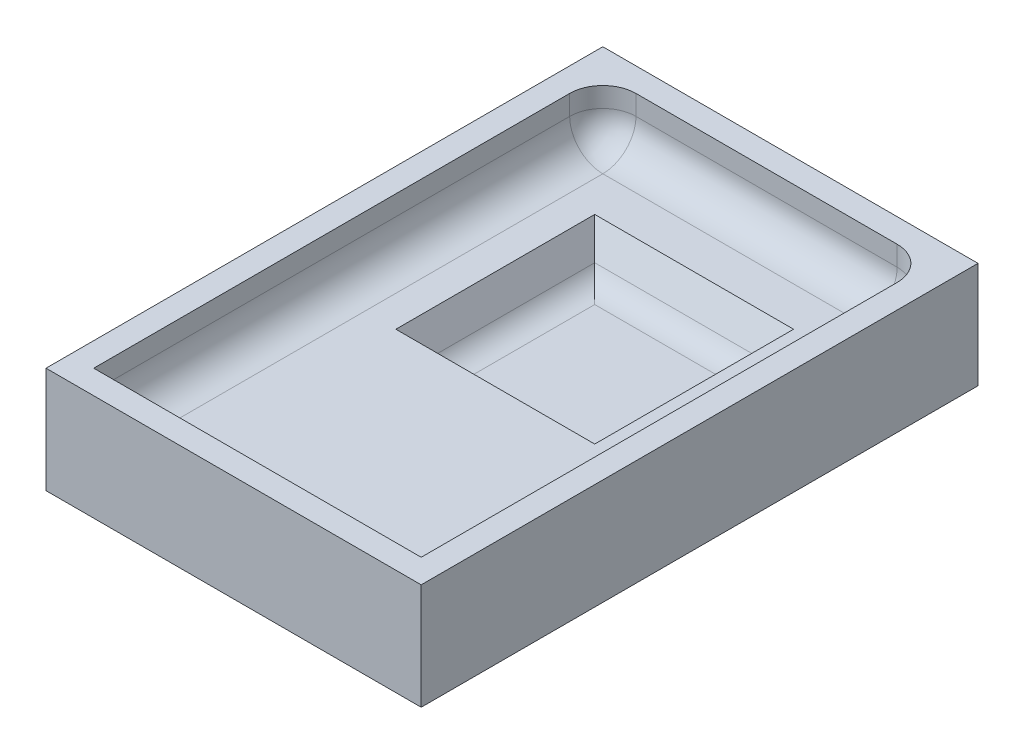
ISO-10303-21;
HEADER;
FILE_DESCRIPTION(('STEP AP214'),'2;1');
FILE_NAME('part.step','',(''),(''),'','','');
FILE_SCHEMA(('AUTOMOTIVE_DESIGN { 1 0 10303 214 1 1 1 1 }'));
ENDSEC;
DATA;
#1=APPLICATION_CONTEXT('core data for automotive mechanical design processes');
#2=APPLICATION_PROTOCOL_DEFINITION('international standard','automotive_design',2000,#1);
#3=PRODUCT_CONTEXT('',#1,'mechanical');
#4=PRODUCT('Part','Part','',(#3));
#5=PRODUCT_RELATED_PRODUCT_CATEGORY('part','',(#4));
#6=PRODUCT_DEFINITION_FORMATION('','',#4);
#7=PRODUCT_DEFINITION_CONTEXT('part definition',#1,'design');
#8=PRODUCT_DEFINITION('design','',#6,#7);
#9=PRODUCT_DEFINITION_SHAPE('','',#8);
#10=(LENGTH_UNIT() NAMED_UNIT(*) SI_UNIT(.MILLI.,.METRE.));
#11=(NAMED_UNIT(*) PLANE_ANGLE_UNIT() SI_UNIT($,.RADIAN.));
#12=(NAMED_UNIT(*) SI_UNIT($,.STERADIAN.) SOLID_ANGLE_UNIT());
#13=UNCERTAINTY_MEASURE_WITH_UNIT(LENGTH_MEASURE(1.E-05),#10,'distance_accuracy_value','');
#14=(GEOMETRIC_REPRESENTATION_CONTEXT(3) GLOBAL_UNCERTAINTY_ASSIGNED_CONTEXT((#13)) GLOBAL_UNIT_ASSIGNED_CONTEXT((#10,
#11,#12)) REPRESENTATION_CONTEXT('',''));
#15=CARTESIAN_POINT('',(0.,0.,0.));
#16=DIRECTION('',(0.,0.,1.));
#17=DIRECTION('',(1.,0.,0.));
#18=AXIS2_PLACEMENT_3D('',#15,#16,#17);
#19=CARTESIAN_POINT('',(0.,4.,0.));
#20=DIRECTION('',(0.,-1.,0.));
#21=DIRECTION('',(0.,0.,-1.));
#22=AXIS2_PLACEMENT_3D('',#19,#20,#21);
#23=PLANE('',#22);
#24=DIRECTION('',(1.,0.,0.));
#25=VECTOR('',#24,1.);
#26=CARTESIAN_POINT('',(1.8,4.,-1.8));
#27=LINE('',#26,#25);
#28=CARTESIAN_POINT('',(4.30000000000001,4.,-1.8));
#29=VERTEX_POINT('',#28);
#30=CARTESIAN_POINT('',(24.,4.,-1.8));
#31=VERTEX_POINT('',#30);
#32=EDGE_CURVE('E175',#29,#31,#27,.T.);
#33=ORIENTED_EDGE('',*,*,#32,.T.);
#34=DIRECTION('',(0.,0.,-1.));
#35=VECTOR('',#34,1.);
#36=CARTESIAN_POINT('',(24.,4.,0.));
#37=LINE('',#36,#35);
#38=CARTESIAN_POINT('',(24.,4.,-37.7));
#39=VERTEX_POINT('',#38);
#40=EDGE_CURVE('E324',#31,#39,#37,.T.);
#41=ORIENTED_EDGE('',*,*,#40,.T.);
#42=DIRECTION('',(-1.,0.,0.));
#43=VECTOR('',#42,1.);
#44=CARTESIAN_POINT('',(0.,4.,-37.7));
#45=LINE('',#44,#43);
#46=CARTESIAN_POINT('',(4.30000000000001,4.,-37.7));
#47=VERTEX_POINT('',#46);
#48=EDGE_CURVE('E321',#39,#47,#45,.T.);
#49=ORIENTED_EDGE('',*,*,#48,.T.);
#50=DIRECTION('',(0.,0.,1.));
#51=VECTOR('',#50,1.);
#52=CARTESIAN_POINT('',(4.30000000000001,4.,0.));
#53=LINE('',#52,#51);
#54=EDGE_CURVE('E306',#47,#29,#53,.T.);
#55=ORIENTED_EDGE('',*,*,#54,.T.);
#56=EDGE_LOOP('',(#33,#41,#49,#55));
#57=FACE_BOUND('',#56,.T.);
#58=DIRECTION('',(1.,0.,0.));
#59=VECTOR('',#58,1.);
#60=CARTESIAN_POINT('',(6.65,4.,-19.74));
#61=LINE('',#60,#59);
#62=CARTESIAN_POINT('',(6.65,4.,-19.74));
#63=VERTEX_POINT('',#62);
#64=CARTESIAN_POINT('',(21.65,4.,-19.74));
#65=VERTEX_POINT('',#64);
#66=EDGE_CURVE('E226',#63,#65,#61,.T.);
#67=ORIENTED_EDGE('',*,*,#66,.F.);
#68=DIRECTION('',(0.,0.,1.));
#69=VECTOR('',#68,1.);
#70=CARTESIAN_POINT('',(6.65,4.,-34.74));
#71=LINE('',#70,#69);
#72=CARTESIAN_POINT('',(6.65,4.,-34.74));
#73=VERTEX_POINT('',#72);
#74=EDGE_CURVE('E222',#73,#63,#71,.T.);
#75=ORIENTED_EDGE('',*,*,#74,.F.);
#76=DIRECTION('',(-1.,0.,0.));
#77=VECTOR('',#76,1.);
#78=CARTESIAN_POINT('',(6.65,4.,-34.74));
#79=LINE('',#78,#77);
#80=CARTESIAN_POINT('',(21.65,4.,-34.74));
#81=VERTEX_POINT('',#80);
#82=EDGE_CURVE('E235',#81,#73,#79,.T.);
#83=ORIENTED_EDGE('',*,*,#82,.F.);
#84=DIRECTION('',(0.,0.,-1.));
#85=VECTOR('',#84,1.);
#86=CARTESIAN_POINT('',(21.65,4.,-34.74));
#87=LINE('',#86,#85);
#88=EDGE_CURVE('E231',#65,#81,#87,.T.);
#89=ORIENTED_EDGE('',*,*,#88,.F.);
#90=EDGE_LOOP('',(#67,#75,#83,#89));
#91=FACE_BOUND('',#90,.T.);
#92=ADVANCED_FACE('F43',(#57,#91),#23,.F.);
#93=CARTESIAN_POINT('',(6.65,4.,-34.74));
#94=DIRECTION('',(0.866025403784438,0.500000000000001,0.));
#95=DIRECTION('',(-0.500000000000001,0.866025403784438,0.));
#96=AXIS2_PLACEMENT_3D('',#93,#94,#95);
#97=PLANE('',#96);
#98=DIRECTION('',(-0.447213595499958,0.774596669241482,0.447213595499959));
#99=VECTOR('',#98,1.);
#100=CARTESIAN_POINT('',(9.65000000000001,-1.19615242270663,-22.74));
#101=LINE('',#100,#99);
#102=CARTESIAN_POINT('',(7.80470053837926,2.,-20.8947005383793));
#103=VERTEX_POINT('',#102);
#104=EDGE_CURVE('E239',#103,#63,#101,.T.);
#105=ORIENTED_EDGE('',*,*,#104,.F.);
#106=DIRECTION('',(0.,0.,1.));
#107=VECTOR('',#106,1.);
#108=CARTESIAN_POINT('',(7.80470053837925,2.,-34.74));
#109=LINE('',#108,#107);
#110=CARTESIAN_POINT('',(7.80470053837925,2.,-33.5852994616207));
#111=VERTEX_POINT('',#110);
#112=EDGE_CURVE('E303',#103,#111,#109,.F.);
#113=ORIENTED_EDGE('',*,*,#112,.T.);
#114=DIRECTION('',(-0.447213595499959,0.774596669241482,-0.447213595499959));
#115=VECTOR('',#114,1.);
#116=CARTESIAN_POINT('',(6.65,4.,-34.74));
#117=LINE('',#116,#115);
#118=EDGE_CURVE('E245',#111,#73,#117,.T.);
#119=ORIENTED_EDGE('',*,*,#118,.T.);
#120=ORIENTED_EDGE('',*,*,#74,.T.);
#121=EDGE_LOOP('',(#105,#113,#119,#120));
#122=FACE_BOUND('',#121,.T.);
#123=ADVANCED_FACE('F417',(#122),#97,.T.);
#124=CARTESIAN_POINT('',(6.65,4.,-34.74));
#125=DIRECTION('',(0.,0.500000000000001,0.866025403784438));
#126=DIRECTION('',(0.,-0.866025403784438,0.500000000000001));
#127=AXIS2_PLACEMENT_3D('',#124,#125,#126);
#128=PLANE('',#127);
#129=ORIENTED_EDGE('',*,*,#118,.F.);
#130=DIRECTION('',(-1.,0.,0.));
#131=VECTOR('',#130,1.);
#132=CARTESIAN_POINT('',(6.65,1.99999999999999,-33.5852994616207));
#133=LINE('',#132,#131);
#134=CARTESIAN_POINT('',(20.4952994616207,2.,-33.5852994616207));
#135=VERTEX_POINT('',#134);
#136=EDGE_CURVE('E293',#111,#135,#133,.F.);
#137=ORIENTED_EDGE('',*,*,#136,.T.);
#138=DIRECTION('',(0.447213595499959,0.774596669241482,-0.447213595499959));
#139=VECTOR('',#138,1.);
#140=CARTESIAN_POINT('',(21.65,4.,-34.74));
#141=LINE('',#140,#139);
#142=EDGE_CURVE('E276',#135,#81,#141,.T.);
#143=ORIENTED_EDGE('',*,*,#142,.T.);
#144=ORIENTED_EDGE('',*,*,#82,.T.);
#145=EDGE_LOOP('',(#129,#137,#143,#144));
#146=FACE_BOUND('',#145,.T.);
#147=ADVANCED_FACE('F422',(#146),#128,.T.);
#148=CARTESIAN_POINT('',(21.65,4.,-34.74));
#149=DIRECTION('',(-0.866025403784438,0.500000000000001,0.));
#150=DIRECTION('',(-0.500000000000001,-0.866025403784438,0.));
#151=AXIS2_PLACEMENT_3D('',#148,#149,#150);
#152=PLANE('',#151);
#153=ORIENTED_EDGE('',*,*,#142,.F.);
#154=DIRECTION('',(0.,0.,-1.));
#155=VECTOR('',#154,1.);
#156=CARTESIAN_POINT('',(20.4952994616207,2.,-34.74));
#157=LINE('',#156,#155);
#158=CARTESIAN_POINT('',(20.4952994616207,2.,-20.8947005383793));
#159=VERTEX_POINT('',#158);
#160=EDGE_CURVE('E297',#135,#159,#157,.F.);
#161=ORIENTED_EDGE('',*,*,#160,.T.);
#162=DIRECTION('',(0.447213595499958,0.774596669241482,0.447213595499959));
#163=VECTOR('',#162,1.);
#164=CARTESIAN_POINT('',(18.65,-1.19615242270663,-22.74));
#165=LINE('',#164,#163);
#166=EDGE_CURVE('E273',#159,#65,#165,.T.);
#167=ORIENTED_EDGE('',*,*,#166,.T.);
#168=ORIENTED_EDGE('',*,*,#88,.T.);
#169=EDGE_LOOP('',(#153,#161,#167,#168));
#170=FACE_BOUND('',#169,.T.);
#171=ADVANCED_FACE('F447',(#170),#152,.T.);
#172=CARTESIAN_POINT('',(6.65,4.,-19.74));
#173=DIRECTION('',(0.,0.500000000000001,-0.866025403784438));
#174=DIRECTION('',(0.,0.866025403784438,0.500000000000001));
#175=AXIS2_PLACEMENT_3D('',#172,#173,#174);
#176=PLANE('',#175);
#177=ORIENTED_EDGE('',*,*,#166,.F.);
#178=DIRECTION('',(1.,0.,0.));
#179=VECTOR('',#178,1.);
#180=CARTESIAN_POINT('',(6.65,2.,-20.8947005383793));
#181=LINE('',#180,#179);
#182=EDGE_CURVE('E300',#159,#103,#181,.F.);
#183=ORIENTED_EDGE('',*,*,#182,.T.);
#184=ORIENTED_EDGE('',*,*,#104,.T.);
#185=ORIENTED_EDGE('',*,*,#66,.T.);
#186=EDGE_LOOP('',(#177,#183,#184,#185));
#187=FACE_BOUND('',#186,.T.);
#188=ADVANCED_FACE('F444',(#187),#176,.T.);
#189=CARTESIAN_POINT('',(0.,1.,0.));
#190=DIRECTION('',(0.,1.,0.));
#191=DIRECTION('',(0.,0.,1.));
#192=AXIS2_PLACEMENT_3D('',#189,#190,#191);
#193=PLANE('',#192);
#194=DIRECTION('',(0.,0.,1.));
#195=VECTOR('',#194,1.);
#196=CARTESIAN_POINT('',(18.7632486540519,1.,0.));
#197=LINE('',#196,#195);
#198=CARTESIAN_POINT('',(18.7632486540519,1.,-22.6267513459481));
#199=VERTEX_POINT('',#198);
#200=CARTESIAN_POINT('',(18.7632486540519,1.,-31.8532486540519));
#201=VERTEX_POINT('',#200);
#202=EDGE_CURVE('E286',#199,#201,#197,.F.);
#203=ORIENTED_EDGE('',*,*,#202,.T.);
#204=DIRECTION('',(1.,0.,0.));
#205=VECTOR('',#204,1.);
#206=CARTESIAN_POINT('',(0.,1.,-31.8532486540519));
#207=LINE('',#206,#205);
#208=CARTESIAN_POINT('',(9.53675134594813,1.,-31.8532486540519));
#209=VERTEX_POINT('',#208);
#210=EDGE_CURVE('E289',#201,#209,#207,.F.);
#211=ORIENTED_EDGE('',*,*,#210,.T.);
#212=DIRECTION('',(0.,0.,-1.));
#213=VECTOR('',#212,1.);
#214=CARTESIAN_POINT('',(9.53675134594814,1.,0.));
#215=LINE('',#214,#213);
#216=CARTESIAN_POINT('',(9.53675134594813,1.,-22.6267513459481));
#217=VERTEX_POINT('',#216);
#218=EDGE_CURVE('E270',#209,#217,#215,.F.);
#219=ORIENTED_EDGE('',*,*,#218,.T.);
#220=DIRECTION('',(-1.,0.,0.));
#221=VECTOR('',#220,1.);
#222=CARTESIAN_POINT('',(0.,1.,-22.6267513459481));
#223=LINE('',#222,#221);
#224=EDGE_CURVE('E283',#217,#199,#223,.F.);
#225=ORIENTED_EDGE('',*,*,#224,.T.);
#226=EDGE_LOOP('',(#203,#211,#219,#225));
#227=FACE_BOUND('',#226,.T.);
#228=ADVANCED_FACE('F427',(#227),#193,.T.);
#229=CARTESIAN_POINT('',(0.,3.,-22.6267513459481));
#230=DIRECTION('',(-1.,0.,0.));
#231=DIRECTION('',(0.,0.,1.));
#232=AXIS2_PLACEMENT_3D('',#229,#230,#231);
#233=CYLINDRICAL_SURFACE('',#232,2.);
#234=CARTESIAN_POINT('',(9.53675134594813,3.,-22.6267513459481));
#235=DIRECTION('',(-0.707106781186548,0.,-0.707106781186547));
#236=DIRECTION('',(-0.707106781186547,0.,0.707106781186548));
#237=AXIS2_PLACEMENT_3D('',#234,#235,#236);
#238=ELLIPSE('',#237,2.82842712474619,2.);
#239=EDGE_CURVE('E312',#103,#217,#238,.F.);
#240=ORIENTED_EDGE('',*,*,#239,.F.);
#241=ORIENTED_EDGE('',*,*,#182,.F.);
#242=CARTESIAN_POINT('',(18.7632486540519,3.,-22.6267513459481));
#243=DIRECTION('',(-0.707106781186548,0.,0.707106781186547));
#244=DIRECTION('',(0.707106781186547,0.,0.707106781186548));
#245=AXIS2_PLACEMENT_3D('',#242,#243,#244);
#246=ELLIPSE('',#245,2.82842712474619,2.);
#247=EDGE_CURVE('E227',#199,#159,#246,.T.);
#248=ORIENTED_EDGE('',*,*,#247,.F.);
#249=ORIENTED_EDGE('',*,*,#224,.F.);
#250=EDGE_LOOP('',(#240,#241,#248,#249));
#251=FACE_BOUND('',#250,.T.);
#252=ADVANCED_FACE('F466',(#251),#233,.F.);
#253=CARTESIAN_POINT('',(18.7632486540519,3.,0.));
#254=DIRECTION('',(0.,0.,1.));
#255=DIRECTION('',(1.,0.,0.));
#256=AXIS2_PLACEMENT_3D('',#253,#254,#255);
#257=CYLINDRICAL_SURFACE('',#256,2.);
#258=ORIENTED_EDGE('',*,*,#247,.T.);
#259=ORIENTED_EDGE('',*,*,#160,.F.);
#260=CARTESIAN_POINT('',(18.7632486540519,3.,-31.8532486540519));
#261=DIRECTION('',(0.707106781186547,0.,0.707106781186548));
#262=DIRECTION('',(0.707106781186548,0.,-0.707106781186547));
#263=AXIS2_PLACEMENT_3D('',#260,#261,#262);
#264=ELLIPSE('',#263,2.82842712474619,2.);
#265=EDGE_CURVE('E309',#201,#135,#264,.T.);
#266=ORIENTED_EDGE('',*,*,#265,.F.);
#267=ORIENTED_EDGE('',*,*,#202,.F.);
#268=EDGE_LOOP('',(#258,#259,#266,#267));
#269=FACE_BOUND('',#268,.T.);
#270=ADVANCED_FACE('F462',(#269),#257,.F.);
#271=CARTESIAN_POINT('',(9.53675134594814,3.,0.));
#272=DIRECTION('',(0.,0.,-1.));
#273=DIRECTION('',(-1.,0.,0.));
#274=AXIS2_PLACEMENT_3D('',#271,#272,#273);
#275=CYLINDRICAL_SURFACE('',#274,2.);
#276=ORIENTED_EDGE('',*,*,#239,.T.);
#277=ORIENTED_EDGE('',*,*,#218,.F.);
#278=CARTESIAN_POINT('',(9.53675134594813,3.,-31.8532486540519));
#279=DIRECTION('',(0.707106781186547,0.,-0.707106781186548));
#280=DIRECTION('',(0.707106781186548,0.,0.707106781186547));
#281=AXIS2_PLACEMENT_3D('',#278,#279,#280);
#282=ELLIPSE('',#281,2.82842712474619,2.);
#283=EDGE_CURVE('E221',#111,#209,#282,.F.);
#284=ORIENTED_EDGE('',*,*,#283,.F.);
#285=ORIENTED_EDGE('',*,*,#112,.F.);
#286=EDGE_LOOP('',(#276,#277,#284,#285));
#287=FACE_BOUND('',#286,.T.);
#288=ADVANCED_FACE('F458',(#287),#275,.F.);
#289=CARTESIAN_POINT('',(0.,3.,-31.8532486540519));
#290=DIRECTION('',(1.,0.,0.));
#291=DIRECTION('',(0.,0.,-1.));
#292=AXIS2_PLACEMENT_3D('',#289,#290,#291);
#293=CYLINDRICAL_SURFACE('',#292,2.);
#294=ORIENTED_EDGE('',*,*,#265,.T.);
#295=ORIENTED_EDGE('',*,*,#136,.F.);
#296=ORIENTED_EDGE('',*,*,#283,.T.);
#297=ORIENTED_EDGE('',*,*,#210,.F.);
#298=EDGE_LOOP('',(#294,#295,#296,#297));
#299=FACE_BOUND('',#298,.T.);
#300=ADVANCED_FACE('F455',(#299),#293,.F.);
#301=CARTESIAN_POINT('',(0.,8.,0.));
#302=DIRECTION('',(0.,1.,0.));
#303=DIRECTION('',(0.,0.,1.));
#304=AXIS2_PLACEMENT_3D('',#301,#302,#303);
#305=PLANE('',#304);
#306=DIRECTION('',(0.,0.,1.));
#307=VECTOR('',#306,1.);
#308=CARTESIAN_POINT('',(0.,8.,-42.));
#309=LINE('',#308,#307);
#310=CARTESIAN_POINT('',(0.,8.,-42.));
#311=VERTEX_POINT('',#310);
#312=CARTESIAN_POINT('',(0.,8.,0.));
#313=VERTEX_POINT('',#312);
#314=EDGE_CURVE('E185',#311,#313,#309,.T.);
#315=ORIENTED_EDGE('',*,*,#314,.T.);
#316=DIRECTION('',(1.,0.,0.));
#317=VECTOR('',#316,1.);
#318=CARTESIAN_POINT('',(0.,8.,0.));
#319=LINE('',#318,#317);
#320=CARTESIAN_POINT('',(28.3,8.,0.));
#321=VERTEX_POINT('',#320);
#322=EDGE_CURVE('E209',#313,#321,#319,.T.);
#323=ORIENTED_EDGE('',*,*,#322,.T.);
#324=DIRECTION('',(0.,0.,-1.));
#325=VECTOR('',#324,1.);
#326=CARTESIAN_POINT('',(28.3,8.,-42.));
#327=LINE('',#326,#325);
#328=CARTESIAN_POINT('',(28.3,8.,-42.));
#329=VERTEX_POINT('',#328);
#330=EDGE_CURVE('E213',#321,#329,#327,.T.);
#331=ORIENTED_EDGE('',*,*,#330,.T.);
#332=DIRECTION('',(-1.,0.,0.));
#333=VECTOR('',#332,1.);
#334=CARTESIAN_POINT('',(0.,8.,-42.));
#335=LINE('',#334,#333);
#336=EDGE_CURVE('E217',#329,#311,#335,.T.);
#337=ORIENTED_EDGE('',*,*,#336,.T.);
#338=EDGE_LOOP('',(#315,#323,#331,#337));
#339=FACE_BOUND('',#338,.T.);
#340=DIRECTION('',(1.,0.,0.));
#341=VECTOR('',#340,1.);
#342=CARTESIAN_POINT('',(1.8,8.,-1.8));
#343=LINE('',#342,#341);
#344=CARTESIAN_POINT('',(1.8,8.,-1.8));
#345=VERTEX_POINT('',#344);
#346=CARTESIAN_POINT('',(26.5,8.,-1.8));
#347=VERTEX_POINT('',#346);
#348=EDGE_CURVE('E174',#345,#347,#343,.T.);
#349=ORIENTED_EDGE('',*,*,#348,.F.);
#350=DIRECTION('',(0.,0.,1.));
#351=VECTOR('',#350,1.);
#352=CARTESIAN_POINT('',(1.8,8.,-40.2));
#353=LINE('',#352,#351);
#354=CARTESIAN_POINT('',(1.8,8.,-37.7));
#355=VERTEX_POINT('',#354);
#356=EDGE_CURVE('E166',#355,#345,#353,.T.);
#357=ORIENTED_EDGE('',*,*,#356,.F.);
#358=CARTESIAN_POINT('',(4.30000000000001,8.,-37.7));
#359=DIRECTION('',(0.,1.,0.));
#360=DIRECTION('',(0.,0.,1.));
#361=AXIS2_PLACEMENT_3D('',#358,#359,#360);
#362=CIRCLE('',#361,2.5);
#363=CARTESIAN_POINT('',(4.30000000000001,8.,-40.2));
#364=VERTEX_POINT('',#363);
#365=EDGE_CURVE('E11',#355,#364,#362,.F.);
#366=ORIENTED_EDGE('',*,*,#365,.T.);
#367=DIRECTION('',(-1.,0.,0.));
#368=VECTOR('',#367,1.);
#369=CARTESIAN_POINT('',(1.8,8.,-40.2));
#370=LINE('',#369,#368);
#371=CARTESIAN_POINT('',(24.,8.,-40.2));
#372=VERTEX_POINT('',#371);
#373=EDGE_CURVE('E195',#372,#364,#370,.T.);
#374=ORIENTED_EDGE('',*,*,#373,.F.);
#375=CARTESIAN_POINT('',(24.,8.,-37.7));
#376=DIRECTION('',(0.,1.,0.));
#377=DIRECTION('',(0.,0.,1.));
#378=AXIS2_PLACEMENT_3D('',#375,#376,#377);
#379=CIRCLE('',#378,2.5);
#380=CARTESIAN_POINT('',(26.5,8.,-37.7));
#381=VERTEX_POINT('',#380);
#382=EDGE_CURVE('E53',#372,#381,#379,.F.);
#383=ORIENTED_EDGE('',*,*,#382,.T.);
#384=DIRECTION('',(0.,0.,-1.));
#385=VECTOR('',#384,1.);
#386=CARTESIAN_POINT('',(26.5,8.,-40.2));
#387=LINE('',#386,#385);
#388=EDGE_CURVE('E191',#347,#381,#387,.T.);
#389=ORIENTED_EDGE('',*,*,#388,.F.);
#390=EDGE_LOOP('',(#349,#357,#366,#374,#383,#389));
#391=FACE_BOUND('',#390,.T.);
#392=ADVANCED_FACE('F189',(#339,#391),#305,.T.);
#393=CARTESIAN_POINT('',(1.8,8.,-40.2));
#394=DIRECTION('',(1.,0.,0.));
#395=DIRECTION('',(0.,0.,-1.));
#396=AXIS2_PLACEMENT_3D('',#393,#394,#395);
#397=PLANE('',#396);
#398=DIRECTION('',(0.,0.,1.));
#399=VECTOR('',#398,1.);
#400=CARTESIAN_POINT('',(1.8,6.5,-40.2));
#401=LINE('',#400,#399);
#402=CARTESIAN_POINT('',(1.8,6.5,-1.8));
#403=VERTEX_POINT('',#402);
#404=CARTESIAN_POINT('',(1.8,6.5,-37.7));
#405=VERTEX_POINT('',#404);
#406=EDGE_CURVE('E61',#403,#405,#401,.F.);
#407=ORIENTED_EDGE('',*,*,#406,.T.);
#408=DIRECTION('',(0.,-1.,0.));
#409=VECTOR('',#408,1.);
#410=CARTESIAN_POINT('',(1.8,8.,-37.7));
#411=LINE('',#410,#409);
#412=EDGE_CURVE('E65',#405,#355,#411,.F.);
#413=ORIENTED_EDGE('',*,*,#412,.T.);
#414=ORIENTED_EDGE('',*,*,#356,.T.);
#415=DIRECTION('',(0.,-1.,0.));
#416=VECTOR('',#415,1.);
#417=CARTESIAN_POINT('',(1.8,8.,-1.8));
#418=LINE('',#417,#416);
#419=EDGE_CURVE('E169',#345,#403,#418,.T.);
#420=ORIENTED_EDGE('',*,*,#419,.T.);
#421=EDGE_LOOP('',(#407,#413,#414,#420));
#422=FACE_BOUND('',#421,.T.);
#423=ADVANCED_FACE('F168',(#422),#397,.T.);
#424=CARTESIAN_POINT('',(1.8,8.,-1.8));
#425=DIRECTION('',(0.,0.,-1.));
#426=DIRECTION('',(-1.,0.,0.));
#427=AXIS2_PLACEMENT_3D('',#424,#425,#426);
#428=PLANE('',#427);
#429=DIRECTION('',(0.,-1.,0.));
#430=VECTOR('',#429,1.);
#431=CARTESIAN_POINT('',(26.5,8.,-1.8));
#432=LINE('',#431,#430);
#433=CARTESIAN_POINT('',(26.5,6.5,-1.8));
#434=VERTEX_POINT('',#433);
#435=EDGE_CURVE('E186',#347,#434,#432,.T.);
#436=ORIENTED_EDGE('',*,*,#435,.T.);
#437=CARTESIAN_POINT('',(24.,6.5,-1.8));
#438=DIRECTION('',(0.,0.,-1.));
#439=DIRECTION('',(-1.,0.,0.));
#440=AXIS2_PLACEMENT_3D('',#437,#438,#439);
#441=CIRCLE('',#440,2.5);
#442=EDGE_CURVE('E336',#434,#31,#441,.T.);
#443=ORIENTED_EDGE('',*,*,#442,.T.);
#444=ORIENTED_EDGE('',*,*,#32,.F.);
#445=CARTESIAN_POINT('',(4.30000000000001,6.5,-1.8));
#446=DIRECTION('',(0.,0.,-1.));
#447=DIRECTION('',(-1.,0.,0.));
#448=AXIS2_PLACEMENT_3D('',#445,#446,#447);
#449=CIRCLE('',#448,2.5);
#450=EDGE_CURVE('E183',#29,#403,#449,.T.);
#451=ORIENTED_EDGE('',*,*,#450,.T.);
#452=ORIENTED_EDGE('',*,*,#419,.F.);
#453=ORIENTED_EDGE('',*,*,#348,.T.);
#454=EDGE_LOOP('',(#436,#443,#444,#451,#452,#453));
#455=FACE_BOUND('',#454,.T.);
#456=ADVANCED_FACE('F179',(#455),#428,.T.);
#457=CARTESIAN_POINT('',(26.5,8.,-40.2));
#458=DIRECTION('',(-1.,0.,0.));
#459=DIRECTION('',(0.,0.,1.));
#460=AXIS2_PLACEMENT_3D('',#457,#458,#459);
#461=PLANE('',#460);
#462=DIRECTION('',(0.,-1.,0.));
#463=VECTOR('',#462,1.);
#464=CARTESIAN_POINT('',(26.5,4.,-37.7));
#465=LINE('',#464,#463);
#466=CARTESIAN_POINT('',(26.5,6.5,-37.7));
#467=VERTEX_POINT('',#466);
#468=EDGE_CURVE('E328',#381,#467,#465,.T.);
#469=ORIENTED_EDGE('',*,*,#468,.T.);
#470=DIRECTION('',(0.,0.,-1.));
#471=VECTOR('',#470,1.);
#472=CARTESIAN_POINT('',(26.5,6.5,-40.2));
#473=LINE('',#472,#471);
#474=EDGE_CURVE('E331',#467,#434,#473,.F.);
#475=ORIENTED_EDGE('',*,*,#474,.T.);
#476=ORIENTED_EDGE('',*,*,#435,.F.);
#477=ORIENTED_EDGE('',*,*,#388,.T.);
#478=EDGE_LOOP('',(#469,#475,#476,#477));
#479=FACE_BOUND('',#478,.T.);
#480=ADVANCED_FACE('F397',(#479),#461,.T.);
#481=CARTESIAN_POINT('',(1.8,8.,-40.2));
#482=DIRECTION('',(0.,0.,1.));
#483=DIRECTION('',(1.,0.,0.));
#484=AXIS2_PLACEMENT_3D('',#481,#482,#483);
#485=PLANE('',#484);
#486=DIRECTION('',(-1.,0.,0.));
#487=VECTOR('',#486,1.);
#488=CARTESIAN_POINT('',(1.8,6.5,-40.2));
#489=LINE('',#488,#487);
#490=CARTESIAN_POINT('',(4.30000000000001,6.5,-40.2));
#491=VERTEX_POINT('',#490);
#492=CARTESIAN_POINT('',(24.,6.5,-40.2));
#493=VERTEX_POINT('',#492);
#494=EDGE_CURVE('E339',#491,#493,#489,.F.);
#495=ORIENTED_EDGE('',*,*,#494,.T.);
#496=DIRECTION('',(0.,-1.,0.));
#497=VECTOR('',#496,1.);
#498=CARTESIAN_POINT('',(24.,8.,-40.2));
#499=LINE('',#498,#497);
#500=EDGE_CURVE('E345',#493,#372,#499,.F.);
#501=ORIENTED_EDGE('',*,*,#500,.T.);
#502=ORIENTED_EDGE('',*,*,#373,.T.);
#503=DIRECTION('',(0.,-1.,0.));
#504=VECTOR('',#503,1.);
#505=CARTESIAN_POINT('',(4.30000000000001,4.,-40.2));
#506=LINE('',#505,#504);
#507=EDGE_CURVE('E342',#364,#491,#506,.T.);
#508=ORIENTED_EDGE('',*,*,#507,.T.);
#509=EDGE_LOOP('',(#495,#501,#502,#508));
#510=FACE_BOUND('',#509,.T.);
#511=ADVANCED_FACE('F387',(#510),#485,.T.);
#512=CARTESIAN_POINT('',(0.,0.,0.));
#513=DIRECTION('',(0.,-1.,0.));
#514=DIRECTION('',(0.,0.,-1.));
#515=AXIS2_PLACEMENT_3D('',#512,#513,#514);
#516=PLANE('',#515);
#517=DIRECTION('',(0.,0.,1.));
#518=VECTOR('',#517,1.);
#519=CARTESIAN_POINT('',(0.,0.,0.));
#520=LINE('',#519,#518);
#521=CARTESIAN_POINT('',(0.,0.,-42.));
#522=VERTEX_POINT('',#521);
#523=CARTESIAN_POINT('',(0.,0.,0.));
#524=VERTEX_POINT('',#523);
#525=EDGE_CURVE('E240',#522,#524,#520,.T.);
#526=ORIENTED_EDGE('',*,*,#525,.F.);
#527=DIRECTION('',(-1.,0.,0.));
#528=VECTOR('',#527,1.);
#529=CARTESIAN_POINT('',(0.,0.,-42.));
#530=LINE('',#529,#528);
#531=CARTESIAN_POINT('',(28.3,0.,-42.));
#532=VERTEX_POINT('',#531);
#533=EDGE_CURVE('E251',#532,#522,#530,.T.);
#534=ORIENTED_EDGE('',*,*,#533,.F.);
#535=DIRECTION('',(0.,0.,-1.));
#536=VECTOR('',#535,1.);
#537=CARTESIAN_POINT('',(28.3,0.,0.));
#538=LINE('',#537,#536);
#539=CARTESIAN_POINT('',(28.3,0.,0.));
#540=VERTEX_POINT('',#539);
#541=EDGE_CURVE('E248',#540,#532,#538,.T.);
#542=ORIENTED_EDGE('',*,*,#541,.F.);
#543=DIRECTION('',(1.,0.,0.));
#544=VECTOR('',#543,1.);
#545=CARTESIAN_POINT('',(0.,0.,0.));
#546=LINE('',#545,#544);
#547=EDGE_CURVE('E244',#524,#540,#546,.T.);
#548=ORIENTED_EDGE('',*,*,#547,.F.);
#549=EDGE_LOOP('',(#526,#534,#542,#548));
#550=FACE_BOUND('',#549,.T.);
#551=ADVANCED_FACE('F429',(#550),#516,.T.);
#552=CARTESIAN_POINT('',(0.,4.,-42.));
#553=DIRECTION('',(0.,0.,1.));
#554=DIRECTION('',(1.,0.,0.));
#555=AXIS2_PLACEMENT_3D('',#552,#553,#554);
#556=PLANE('',#555);
#557=ORIENTED_EDGE('',*,*,#533,.T.);
#558=DIRECTION('',(0.,-1.,0.));
#559=VECTOR('',#558,1.);
#560=CARTESIAN_POINT('',(0.,4.,-42.));
#561=LINE('',#560,#559);
#562=EDGE_CURVE('E254',#311,#522,#561,.T.);
#563=ORIENTED_EDGE('',*,*,#562,.F.);
#564=ORIENTED_EDGE('',*,*,#336,.F.);
#565=DIRECTION('',(0.,-1.,0.));
#566=VECTOR('',#565,1.);
#567=CARTESIAN_POINT('',(28.3,4.,-42.));
#568=LINE('',#567,#566);
#569=EDGE_CURVE('E258',#329,#532,#568,.T.);
#570=ORIENTED_EDGE('',*,*,#569,.T.);
#571=EDGE_LOOP('',(#557,#563,#564,#570));
#572=FACE_BOUND('',#571,.T.);
#573=ADVANCED_FACE('F432',(#572),#556,.F.);
#574=CARTESIAN_POINT('',(28.3,4.,0.));
#575=DIRECTION('',(-1.,0.,0.));
#576=DIRECTION('',(0.,0.,1.));
#577=AXIS2_PLACEMENT_3D('',#574,#575,#576);
#578=PLANE('',#577);
#579=ORIENTED_EDGE('',*,*,#541,.T.);
#580=ORIENTED_EDGE('',*,*,#569,.F.);
#581=ORIENTED_EDGE('',*,*,#330,.F.);
#582=DIRECTION('',(0.,-1.,0.));
#583=VECTOR('',#582,1.);
#584=CARTESIAN_POINT('',(28.3,4.,0.));
#585=LINE('',#584,#583);
#586=EDGE_CURVE('E262',#321,#540,#585,.T.);
#587=ORIENTED_EDGE('',*,*,#586,.T.);
#588=EDGE_LOOP('',(#579,#580,#581,#587));
#589=FACE_BOUND('',#588,.T.);
#590=ADVANCED_FACE('F436',(#589),#578,.F.);
#591=CARTESIAN_POINT('',(0.,4.,0.));
#592=DIRECTION('',(0.,0.,-1.));
#593=DIRECTION('',(-1.,0.,0.));
#594=AXIS2_PLACEMENT_3D('',#591,#592,#593);
#595=PLANE('',#594);
#596=ORIENTED_EDGE('',*,*,#547,.T.);
#597=ORIENTED_EDGE('',*,*,#586,.F.);
#598=ORIENTED_EDGE('',*,*,#322,.F.);
#599=DIRECTION('',(0.,-1.,0.));
#600=VECTOR('',#599,1.);
#601=CARTESIAN_POINT('',(0.,4.,0.));
#602=LINE('',#601,#600);
#603=EDGE_CURVE('E266',#313,#524,#602,.T.);
#604=ORIENTED_EDGE('',*,*,#603,.T.);
#605=EDGE_LOOP('',(#596,#597,#598,#604));
#606=FACE_BOUND('',#605,.T.);
#607=ADVANCED_FACE('F413',(#606),#595,.F.);
#608=CARTESIAN_POINT('',(0.,4.,0.));
#609=DIRECTION('',(1.,0.,0.));
#610=DIRECTION('',(0.,0.,-1.));
#611=AXIS2_PLACEMENT_3D('',#608,#609,#610);
#612=PLANE('',#611);
#613=ORIENTED_EDGE('',*,*,#525,.T.);
#614=ORIENTED_EDGE('',*,*,#603,.F.);
#615=ORIENTED_EDGE('',*,*,#314,.F.);
#616=ORIENTED_EDGE('',*,*,#562,.T.);
#617=EDGE_LOOP('',(#613,#614,#615,#616));
#618=FACE_BOUND('',#617,.T.);
#619=ADVANCED_FACE('F407',(#618),#612,.F.);
#620=CARTESIAN_POINT('',(4.30000000000001,6.5,0.));
#621=DIRECTION('',(0.,0.,1.));
#622=DIRECTION('',(1.,0.,0.));
#623=AXIS2_PLACEMENT_3D('',#620,#621,#622);
#624=CYLINDRICAL_SURFACE('',#623,2.5);
#625=ORIENTED_EDGE('',*,*,#450,.F.);
#626=ORIENTED_EDGE('',*,*,#54,.F.);
#627=CARTESIAN_POINT('',(4.30000000000001,6.5,-37.7));
#628=DIRECTION('',(0.,0.,1.));
#629=DIRECTION('',(1.,0.,0.));
#630=AXIS2_PLACEMENT_3D('',#627,#628,#629);
#631=CIRCLE('',#630,2.5);
#632=EDGE_CURVE('E47',#405,#47,#631,.T.);
#633=ORIENTED_EDGE('',*,*,#632,.F.);
#634=ORIENTED_EDGE('',*,*,#406,.F.);
#635=EDGE_LOOP('',(#625,#626,#633,#634));
#636=FACE_BOUND('',#635,.T.);
#637=ADVANCED_FACE('F45',(#636),#624,.F.);
#638=CARTESIAN_POINT('',(4.30000000000001,8.,-37.7));
#639=DIRECTION('',(0.,1.,0.));
#640=DIRECTION('',(0.,0.,1.));
#641=AXIS2_PLACEMENT_3D('',#638,#639,#640);
#642=CYLINDRICAL_SURFACE('',#641,2.5);
#643=ORIENTED_EDGE('',*,*,#365,.F.);
#644=ORIENTED_EDGE('',*,*,#412,.F.);
#645=CARTESIAN_POINT('',(4.30000000000001,6.5,-37.7));
#646=DIRECTION('',(0.,1.,0.));
#647=DIRECTION('',(0.,0.,1.));
#648=AXIS2_PLACEMENT_3D('',#645,#646,#647);
#649=CIRCLE('',#648,2.5);
#650=EDGE_CURVE('E368',#491,#405,#649,.T.);
#651=ORIENTED_EDGE('',*,*,#650,.F.);
#652=ORIENTED_EDGE('',*,*,#507,.F.);
#653=EDGE_LOOP('',(#643,#644,#651,#652));
#654=FACE_BOUND('',#653,.T.);
#655=ADVANCED_FACE('F406',(#654),#642,.F.);
#656=CARTESIAN_POINT('',(4.30000000000001,6.5,-37.7));
#657=DIRECTION('',(-1.,0.,0.));
#658=DIRECTION('',(0.,0.,1.));
#659=AXIS2_PLACEMENT_3D('',#656,#657,#658);
#660=SPHERICAL_SURFACE('',#659,2.5);
#661=ORIENTED_EDGE('',*,*,#650,.T.);
#662=ORIENTED_EDGE('',*,*,#632,.T.);
#663=CARTESIAN_POINT('',(4.30000000000001,6.5,-37.7));
#664=DIRECTION('',(1.,0.,0.));
#665=DIRECTION('',(0.,0.,-1.));
#666=AXIS2_PLACEMENT_3D('',#663,#664,#665);
#667=CIRCLE('',#666,2.5);
#668=EDGE_CURVE('E365',#491,#47,#667,.F.);
#669=ORIENTED_EDGE('',*,*,#668,.F.);
#670=EDGE_LOOP('',(#661,#662,#669));
#671=FACE_BOUND('',#670,.T.);
#672=ADVANCED_FACE('F377',(#671),#660,.F.);
#673=CARTESIAN_POINT('',(0.,6.5,-37.7));
#674=DIRECTION('',(-1.,0.,0.));
#675=DIRECTION('',(0.,0.,1.));
#676=AXIS2_PLACEMENT_3D('',#673,#674,#675);
#677=CYLINDRICAL_SURFACE('',#676,2.5);
#678=ORIENTED_EDGE('',*,*,#668,.T.);
#679=ORIENTED_EDGE('',*,*,#48,.F.);
#680=CARTESIAN_POINT('',(24.,6.5,-37.7));
#681=DIRECTION('',(-1.,0.,0.));
#682=DIRECTION('',(0.,0.,1.));
#683=AXIS2_PLACEMENT_3D('',#680,#681,#682);
#684=CIRCLE('',#683,2.5);
#685=EDGE_CURVE('E361',#493,#39,#684,.T.);
#686=ORIENTED_EDGE('',*,*,#685,.F.);
#687=ORIENTED_EDGE('',*,*,#494,.F.);
#688=EDGE_LOOP('',(#678,#679,#686,#687));
#689=FACE_BOUND('',#688,.T.);
#690=ADVANCED_FACE('F383',(#689),#677,.F.);
#691=CARTESIAN_POINT('',(24.,8.,-37.7));
#692=DIRECTION('',(0.,1.,0.));
#693=DIRECTION('',(0.,0.,1.));
#694=AXIS2_PLACEMENT_3D('',#691,#692,#693);
#695=CYLINDRICAL_SURFACE('',#694,2.5);
#696=ORIENTED_EDGE('',*,*,#382,.F.);
#697=ORIENTED_EDGE('',*,*,#500,.F.);
#698=CARTESIAN_POINT('',(24.,6.5,-37.7));
#699=DIRECTION('',(0.,1.,0.));
#700=DIRECTION('',(0.,0.,1.));
#701=AXIS2_PLACEMENT_3D('',#698,#699,#700);
#702=CIRCLE('',#701,2.5);
#703=EDGE_CURVE('E357',#467,#493,#702,.T.);
#704=ORIENTED_EDGE('',*,*,#703,.F.);
#705=ORIENTED_EDGE('',*,*,#468,.F.);
#706=EDGE_LOOP('',(#696,#697,#704,#705));
#707=FACE_BOUND('',#706,.T.);
#708=ADVANCED_FACE('F393',(#707),#695,.F.);
#709=CARTESIAN_POINT('',(24.,6.5,-37.7));
#710=DIRECTION('',(0.,0.,-1.));
#711=DIRECTION('',(-1.,0.,0.));
#712=AXIS2_PLACEMENT_3D('',#709,#710,#711);
#713=SPHERICAL_SURFACE('',#712,2.5);
#714=ORIENTED_EDGE('',*,*,#703,.T.);
#715=ORIENTED_EDGE('',*,*,#685,.T.);
#716=CARTESIAN_POINT('',(24.,6.5,-37.7));
#717=DIRECTION('',(0.,0.,1.));
#718=DIRECTION('',(1.,0.,0.));
#719=AXIS2_PLACEMENT_3D('',#716,#717,#718);
#720=CIRCLE('',#719,2.5);
#721=EDGE_CURVE('E354',#467,#39,#720,.F.);
#722=ORIENTED_EDGE('',*,*,#721,.F.);
#723=EDGE_LOOP('',(#714,#715,#722));
#724=FACE_BOUND('',#723,.T.);
#725=ADVANCED_FACE('F473',(#724),#713,.F.);
#726=CARTESIAN_POINT('',(24.,6.5,0.));
#727=DIRECTION('',(0.,0.,-1.));
#728=DIRECTION('',(-1.,0.,0.));
#729=AXIS2_PLACEMENT_3D('',#726,#727,#728);
#730=CYLINDRICAL_SURFACE('',#729,2.5);
#731=ORIENTED_EDGE('',*,*,#442,.F.);
#732=ORIENTED_EDGE('',*,*,#474,.F.);
#733=ORIENTED_EDGE('',*,*,#721,.T.);
#734=ORIENTED_EDGE('',*,*,#40,.F.);
#735=EDGE_LOOP('',(#731,#732,#733,#734));
#736=FACE_BOUND('',#735,.T.);
#737=ADVANCED_FACE('F401',(#736),#730,.F.);
#738=CLOSED_SHELL('',(#92,#123,#147,#171,#188,#228,#252,#270,#288,#300,#392,#423,#456,#480,#511,
#551,#573,#590,#607,#619,#637,#655,#672,#690,#708,#725,#737));
#739=MANIFOLD_SOLID_BREP('B2',#738);
#740=ADVANCED_BREP_SHAPE_REPRESENTATION('',(#18,#739),#14);
#741=SHAPE_DEFINITION_REPRESENTATION(#9,#740);
ENDSEC;
END-ISO-10303-21;
